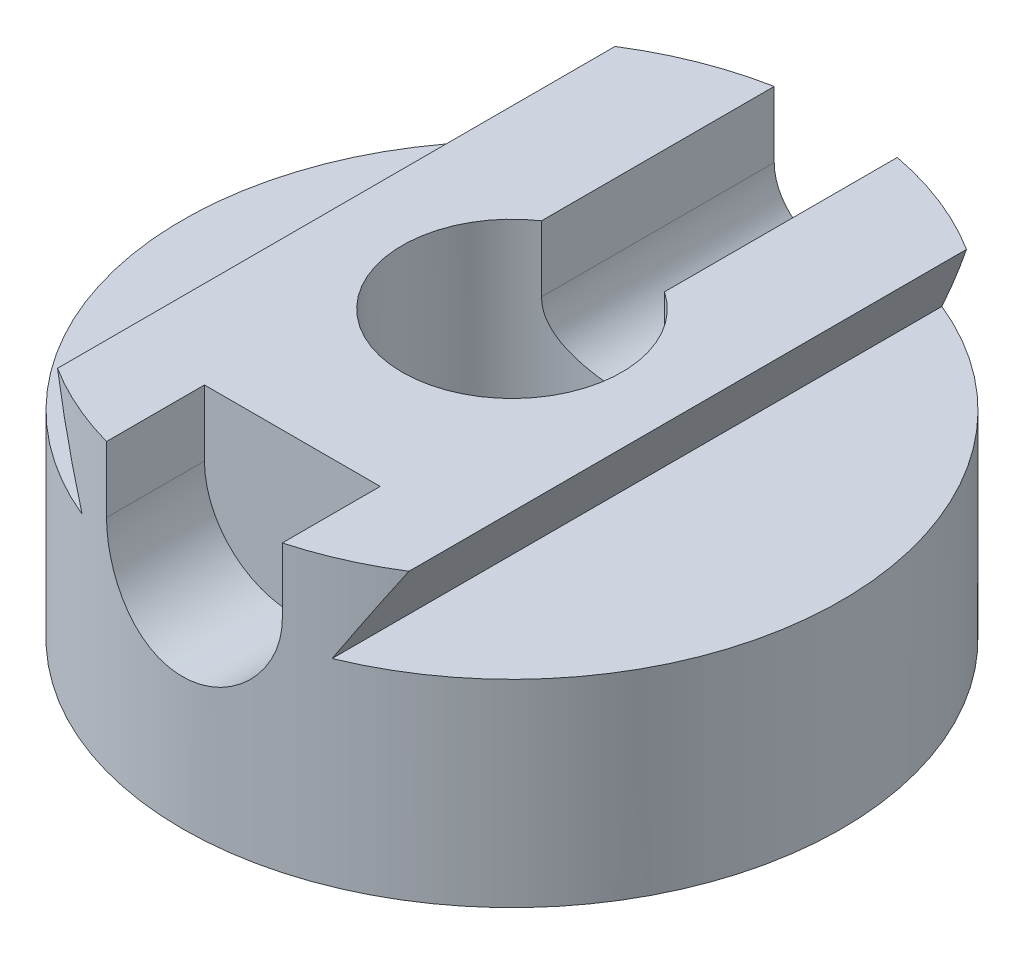
ISO-10303-21;
HEADER;
FILE_DESCRIPTION(('STEP AP214'),'2;1');
FILE_NAME('part.step','',(''),(''),'','','');
FILE_SCHEMA(('AUTOMOTIVE_DESIGN { 1 0 10303 214 1 1 1 1 }'));
ENDSEC;
DATA;
#1=APPLICATION_CONTEXT('core data for automotive mechanical design processes');
#2=APPLICATION_PROTOCOL_DEFINITION('international standard','automotive_design',2000,#1);
#3=PRODUCT_CONTEXT('',#1,'mechanical');
#4=PRODUCT('Part','Part','',(#3));
#5=PRODUCT_RELATED_PRODUCT_CATEGORY('part','',(#4));
#6=PRODUCT_DEFINITION_FORMATION('','',#4);
#7=PRODUCT_DEFINITION_CONTEXT('part definition',#1,'design');
#8=PRODUCT_DEFINITION('design','',#6,#7);
#9=PRODUCT_DEFINITION_SHAPE('','',#8);
#10=(LENGTH_UNIT() NAMED_UNIT(*) SI_UNIT(.MILLI.,.METRE.));
#11=(NAMED_UNIT(*) PLANE_ANGLE_UNIT() SI_UNIT($,.RADIAN.));
#12=(NAMED_UNIT(*) SI_UNIT($,.STERADIAN.) SOLID_ANGLE_UNIT());
#13=UNCERTAINTY_MEASURE_WITH_UNIT(LENGTH_MEASURE(1.E-05),#10,'distance_accuracy_value','');
#14=(GEOMETRIC_REPRESENTATION_CONTEXT(3) GLOBAL_UNCERTAINTY_ASSIGNED_CONTEXT((#13)) GLOBAL_UNIT_ASSIGNED_CONTEXT((#10,
#11,#12)) REPRESENTATION_CONTEXT('',''));
#15=CARTESIAN_POINT('',(0.,0.,0.));
#16=DIRECTION('',(0.,0.,1.));
#17=DIRECTION('',(1.,0.,0.));
#18=AXIS2_PLACEMENT_3D('',#15,#16,#17);
#19=CARTESIAN_POINT('',(0.,65.,0.));
#20=DIRECTION('',(0.,-1.,0.));
#21=DIRECTION('',(0.,0.,-1.));
#22=AXIS2_PLACEMENT_3D('',#19,#20,#21);
#23=CYLINDRICAL_SURFACE('',#22,75.);
#24=CARTESIAN_POINT('',(0.,0.,0.));
#25=DIRECTION('',(0.,1.,0.));
#26=DIRECTION('',(0.,0.,1.));
#27=AXIS2_PLACEMENT_3D('',#24,#25,#26);
#28=CIRCLE('',#27,75.);
#29=CARTESIAN_POINT('',(0.,0.,75.));
#30=VERTEX_POINT('',#29);
#31=EDGE_CURVE('E247',#30,#30,#28,.T.);
#32=ORIENTED_EDGE('',*,*,#31,.T.);
#33=EDGE_LOOP('',(#32));
#34=FACE_BOUND('',#33,.T.);
#35=CARTESIAN_POINT('',(0.,65.,0.));
#36=DIRECTION('',(0.,1.,0.));
#37=DIRECTION('',(0.,0.,1.));
#38=AXIS2_PLACEMENT_3D('',#35,#36,#37);
#39=CIRCLE('',#38,75.);
#40=CARTESIAN_POINT('',(20.,65.,72.2841614740048));
#41=VERTEX_POINT('',#40);
#42=CARTESIAN_POINT('',(40.,65.,63.4428877022476));
#43=VERTEX_POINT('',#42);
#44=EDGE_CURVE('E250',#41,#43,#39,.T.);
#45=ORIENTED_EDGE('',*,*,#44,.F.);
#46=DIRECTION('',(0.,-1.,0.));
#47=VECTOR('',#46,1.);
#48=CARTESIAN_POINT('',(20.,65.,72.2841614740048));
#49=LINE('',#48,#47);
#50=CARTESIAN_POINT('',(20.,50.,72.2841614740048));
#51=VERTEX_POINT('',#50);
#52=EDGE_CURVE('E179',#41,#51,#49,.T.);
#53=ORIENTED_EDGE('',*,*,#52,.T.);
#54=CARTESIAN_POINT('',(-20.,50.,72.2841614740048));
#55=CARTESIAN_POINT('',(-20.0000009389047,49.724090827035,72.2841588743927));
#56=CARTESIAN_POINT('',(-19.9942897855747,49.4482136137117,72.2857416908188));
#57=CARTESIAN_POINT('',(-19.9714655852583,48.8969759323608,72.2920518932551));
#58=CARTESIAN_POINT('',(-19.9543528980324,48.6216154483032,72.2967791800455));
#59=CARTESIAN_POINT('',(-19.8859636757369,47.7971821290675,72.3156334750317));
#60=CARTESIAN_POINT('',(-19.8176359417716,47.249535926604,72.3344329587101));
#61=CARTESIAN_POINT('',(-19.6362791067242,46.163462579828,72.3838747550312));
#62=CARTESIAN_POINT('',(-19.5233463982836,45.6250181507861,72.4144915269438));
#63=CARTESIAN_POINT('',(-19.3212029280493,44.8263554020395,72.4685855711));
#64=CARTESIAN_POINT('',(-19.248359095569,44.5616197505789,72.4879797882607));
#65=CARTESIAN_POINT('',(-19.0918822097284,44.0354904115237,72.529349854291));
#66=CARTESIAN_POINT('',(-19.0082465492059,43.7740975483292,72.5513263268841));
#67=CARTESIAN_POINT('',(-18.7414874232993,42.9959151174134,72.6208684616522));
#68=CARTESIAN_POINT('',(-18.5424347585172,42.4848176566141,72.6720677172806));
#69=CARTESIAN_POINT('',(-18.1034203625736,41.4814272484155,72.7826719872263));
#70=CARTESIAN_POINT('',(-17.8634575357592,40.989134805083,72.8420772213073));
#71=CARTESIAN_POINT('',(-17.4741734974188,40.2671628421776,72.9360751292639));
#72=CARTESIAN_POINT('',(-17.3394757736583,40.0291785955979,72.96823352628));
#73=CARTESIAN_POINT('',(-17.0605679224019,39.5591337301117,73.033947942724));
#74=CARTESIAN_POINT('',(-16.9163602426816,39.3270716080686,73.0675036016962));
#75=CARTESIAN_POINT('',(-16.4697508078497,38.6401786557828,73.1699434516336));
#76=CARTESIAN_POINT('',(-16.1533449871987,38.1946084889382,73.2406048282909));
#77=CARTESIAN_POINT('',(-15.4779357644786,37.3214736861623,73.386344043543));
#78=CARTESIAN_POINT('',(-15.11813559149,36.8945377418555,73.4614854148918));
#79=CARTESIAN_POINT('',(-14.3641879618996,36.0722863830789,73.6126203885893));
#80=CARTESIAN_POINT('',(-13.9700399821952,35.6769714503599,73.6886140039021));
#81=CARTESIAN_POINT('',(-13.1498969359621,34.9204942782193,73.8393800235229));
#82=CARTESIAN_POINT('',(-12.7238968343808,34.5593374588958,73.91415223247));
#83=CARTESIAN_POINT('',(-11.8428337933955,33.8736584662439,74.0604258080261));
#84=CARTESIAN_POINT('',(-11.387770714756,33.5491364684469,74.131927158962));
#85=CARTESIAN_POINT('',(-10.4439906314951,32.9340874851095,74.2708162541828));
#86=CARTESIAN_POINT('',(-9.95485054647007,32.6441900910267,74.3381195022072));
#87=CARTESIAN_POINT('',(-8.95290747552336,32.1067434449995,74.4654311495898));
#88=CARTESIAN_POINT('',(-8.44010415740018,31.8591947878068,74.5254394464933));
#89=CARTESIAN_POINT('',(-7.39451246937258,31.4084636545923,74.6364354304077));
#90=CARTESIAN_POINT('',(-6.86172766673716,31.2052733031046,74.6874247183666));
#91=CARTESIAN_POINT('',(-5.77993995864935,30.8449145807528,74.7789201210429));
#92=CARTESIAN_POINT('',(-5.23093748617975,30.6877449824372,74.8194265153533));
#93=CARTESIAN_POINT('',(-4.13351799290343,30.423861582026,74.8879785633119));
#94=CARTESIAN_POINT('',(-3.58537531226027,30.3160750372337,74.9162882588522));
#95=CARTESIAN_POINT('',(-2.48151614692736,30.1466915236027,74.9609709502207));
#96=CARTESIAN_POINT('',(-1.92579976670742,30.0850939183,74.9773441105293));
#97=CARTESIAN_POINT('',(-0.811003191224979,30.0086420424,74.9976868432757));
#98=CARTESIAN_POINT('',(-0.251923420394365,29.9937819929361,75.0016579491656));
#99=CARTESIAN_POINT('',(0.865461617366286,30.0109236478374,74.9970872818573));
#100=CARTESIAN_POINT('',(1.42376689521104,30.0429246849471,74.9885456868277));
#101=CARTESIAN_POINT('',(2.52135833020087,30.1520984276819,74.9595659441106));
#102=CARTESIAN_POINT('',(3.06076861735047,30.2281093906004,74.9394338292197));
#103=CARTESIAN_POINT('',(4.13107211651945,30.423734021589,74.888058397203));
#104=CARTESIAN_POINT('',(4.66196549645717,30.5433468289046,74.8568152994221));
#105=CARTESIAN_POINT('',(5.71159732055907,30.8251997362582,74.7840520951521));
#106=CARTESIAN_POINT('',(6.23033545950798,30.9874409054378,74.7425317309053));
#107=CARTESIAN_POINT('',(7.25217676710926,31.3532725365359,74.6503123549507));
#108=CARTESIAN_POINT('',(7.75527968959732,31.5568636490972,74.5996131988155));
#109=CARTESIAN_POINT('',(8.74748521491423,32.0060840617605,74.4898189394099));
#110=CARTESIAN_POINT('',(9.23639916808657,32.2521107545978,74.4306454580048));
#111=CARTESIAN_POINT('',(10.1918055532331,32.782980246427,74.3058492610379));
#112=CARTESIAN_POINT('',(10.658297900567,33.0678231919327,74.2402265211334));
#113=CARTESIAN_POINT('',(11.5660115478821,33.6743947180412,74.1042377164168));
#114=CARTESIAN_POINT('',(12.0072292276365,33.9961285630143,74.0338709752226));
#115=CARTESIAN_POINT('',(12.8616123990963,34.6743212304264,73.8902336059676));
#116=CARTESIAN_POINT('',(13.2747773426602,35.0307807310623,73.816962921209));
#117=CARTESIAN_POINT('',(14.0827164003999,35.7875844119563,73.6671639904153));
#118=CARTESIAN_POINT('',(14.4765398766838,36.1889381977153,73.5906046990676));
#119=CARTESIAN_POINT('',(15.2291001578382,37.0234723224029,73.4385589051107));
#120=CARTESIAN_POINT('',(15.5878359965353,37.4566535371569,73.3630724320914));
#121=CARTESIAN_POINT('',(16.2679346581778,38.3522349555349,73.2152679745083));
#122=CARTESIAN_POINT('',(16.5892864557307,38.8146437172764,73.1429509285792));
#123=CARTESIAN_POINT('',(17.0413671753268,39.5276049434427,73.0384537248681));
#124=CARTESIAN_POINT('',(17.1870731659789,39.7684902280272,73.0042835031794));
#125=CARTESIAN_POINT('',(17.4683169931754,40.2564269706133,72.9374991805853));
#126=CARTESIAN_POINT('',(17.6038520136007,40.5034801113103,72.9048855115585));
#127=CARTESIAN_POINT('',(17.9964554966508,41.2564678827596,72.8093439101724));
#128=CARTESIAN_POINT('',(18.2375852211686,41.7711781106441,72.7491678211407));
#129=CARTESIAN_POINT('',(18.6754409668385,42.8201068992815,72.6379997616019));
#130=CARTESIAN_POINT('',(18.8721683475396,43.3543248621479,72.5870075099058));
#131=CARTESIAN_POINT('',(19.1326078908834,44.1669742177175,72.5186271580168));
#132=CARTESIAN_POINT('',(19.2136182349609,44.4396239264584,72.4971925721892));
#133=CARTESIAN_POINT('',(19.3639681142896,44.9882508630952,72.4571789778641));
#134=CARTESIAN_POINT('',(19.4333105688443,45.2642272400857,72.4385992551818));
#135=CARTESIAN_POINT('',(19.6235713180191,46.096292739933,72.3873807158414));
#136=CARTESIAN_POINT('',(19.7268240156717,46.6568333953075,72.3592357394296));
#137=CARTESIAN_POINT('',(19.870573514459,47.6812728490975,72.3198791341929));
#138=CARTESIAN_POINT('',(19.9191182851174,48.1439910865594,72.3065055466939));
#139=CARTESIAN_POINT('',(19.9838187242151,49.0711179248659,72.2886382889566));
#140=CARTESIAN_POINT('',(20.0000256198739,49.5355226828131,72.2841305742343));
#141=CARTESIAN_POINT('',(20.,50.,72.2841614740048));
#142=B_SPLINE_CURVE_WITH_KNOTS('',3,(#54,#55,#56,#57,#58,#59,#60,#61,#62,#63,#64,#65,#66,#67,
#68,#69,#70,#71,#72,#73,#74,#75,#76,#77,#78,#79,#80,#81,#82,#83,#84,#85,#86,#87,#88,#89,#90,#91,
#92,#93,#94,#95,#96,#97,#98,#99,#100,#101,#102,#103,#104,#105,#106,#107,#108,#109,#110,#111,
#112,#113,#114,#115,#116,#117,#118,#119,#120,#121,#122,#123,#124,#125,#126,#127,#128,#129,#130,
#131,#132,#133,#134,#135,#136,#137,#138,#139,#140,#141),.UNSPECIFIED.,.F.,.F.,(4,2,2,2,2,2,2,2,
2,2,2,2,2,2,2,2,2,2,2,2,2,2,2,2,2,2,2,2,2,2,2,2,2,2,2,2,2,2,2,2,2,2,2,4),(0.,0.827600271086224,
1.65517442955861,3.30966047903457,4.96059052863485,5.78615316988952,6.6119156308262,
8.26250052069606,9.91312962335255,10.7389574717174,11.5645735829843,13.2156937599265,
14.9038771965632,16.5920863480183,18.2805629311521,19.9690476040902,21.6846466677335,
23.4002698235206,25.1155881358407,26.8308606935444,28.5068643634646,30.1828449383392,
31.8586182783917,33.5343677573232,35.1677775062473,36.8011550113844,38.4345734863967,
40.0680176652964,41.7176831750604,43.3673549117346,45.0172623519689,46.66720202159,
48.3676678921652,50.068180573599,51.7691935097199,52.6197465661596,53.4705342598249,
55.1830046526352,56.8954226044479,57.7508912247105,58.6061454876003,60.3156612858667,
61.7108602564984,63.1038472979879),.UNSPECIFIED.);
#143=CARTESIAN_POINT('',(-20.,50.,72.2841614740048));
#144=VERTEX_POINT('',#143);
#145=EDGE_CURVE('E12',#144,#51,#142,.T.);
#146=ORIENTED_EDGE('',*,*,#145,.F.);
#147=DIRECTION('',(0.,-1.,0.));
#148=VECTOR('',#147,1.);
#149=CARTESIAN_POINT('',(-20.,65.,72.2841614740048));
#150=LINE('',#149,#148);
#151=CARTESIAN_POINT('',(-20.,65.,72.2841614740048));
#152=VERTEX_POINT('',#151);
#153=EDGE_CURVE('E158',#144,#152,#150,.F.);
#154=ORIENTED_EDGE('',*,*,#153,.T.);
#155=CARTESIAN_POINT('',(-40.,65.,63.4428877022476));
#156=VERTEX_POINT('',#155);
#157=EDGE_CURVE('E256',#156,#152,#39,.T.);
#158=ORIENTED_EDGE('',*,*,#157,.F.);
#159=CARTESIAN_POINT('',(0.,-4.28203230275438,0.));
#160=DIRECTION('',(0.866025403784436,0.500000000000004,0.));
#161=DIRECTION('',(0.500000000000004,-0.866025403784436,0.));
#162=AXIS2_PLACEMENT_3D('',#159,#160,#161);
#163=ELLIPSE('',#162,149.999999999999,75.);
#164=CARTESIAN_POINT('',(-28.4529946162074,45.,69.3932784739997));
#165=VERTEX_POINT('',#164);
#166=EDGE_CURVE('E299',#156,#165,#163,.T.);
#167=ORIENTED_EDGE('',*,*,#166,.T.);
#168=CARTESIAN_POINT('',(0.,45.,0.));
#169=DIRECTION('',(0.,-1.,0.));
#170=DIRECTION('',(0.,0.,-1.));
#171=AXIS2_PLACEMENT_3D('',#168,#169,#170);
#172=CIRCLE('',#171,75.);
#173=CARTESIAN_POINT('',(-28.4529946162074,45.,-69.3932784739997));
#174=VERTEX_POINT('',#173);
#175=EDGE_CURVE('E295',#165,#174,#172,.T.);
#176=ORIENTED_EDGE('',*,*,#175,.T.);
#177=CARTESIAN_POINT('',(-40.,65.,-63.4428877022476));
#178=VERTEX_POINT('',#177);
#179=EDGE_CURVE('E303',#174,#178,#163,.T.);
#180=ORIENTED_EDGE('',*,*,#179,.T.);
#181=CARTESIAN_POINT('',(-14.,65.,-73.6817480791546));
#182=VERTEX_POINT('',#181);
#183=EDGE_CURVE('E259',#182,#178,#39,.T.);
#184=ORIENTED_EDGE('',*,*,#183,.F.);
#185=DIRECTION('',(0.,-1.,0.));
#186=VECTOR('',#185,1.);
#187=CARTESIAN_POINT('',(-14.,65.,-73.6817480791546));
#188=LINE('',#187,#186);
#189=CARTESIAN_POINT('',(-14.,50.,-73.6817480791546));
#190=VERTEX_POINT('',#189);
#191=EDGE_CURVE('E270',#190,#182,#188,.F.);
#192=ORIENTED_EDGE('',*,*,#191,.F.);
#193=CARTESIAN_POINT('',(-14.,50.,-73.6817480791546));
#194=CARTESIAN_POINT('',(-14.0000461131646,49.6099044755248,-73.681715681251));
#195=CARTESIAN_POINT('',(-13.983697595175,49.2198202407486,-73.684844921959));
#196=CARTESIAN_POINT('',(-13.9185479324005,48.4425111343057,-73.6971916183417));
#197=CARTESIAN_POINT('',(-13.8697504773536,48.0552859426012,-73.7064083818092));
#198=CARTESIAN_POINT('',(-13.7401312113113,47.2869857299913,-73.7306779766975));
#199=CARTESIAN_POINT('',(-13.6593548155063,46.9059027814312,-73.7457225310771));
#200=CARTESIAN_POINT('',(-13.4664195247798,46.1520250178608,-73.7811982885116));
#201=CARTESIAN_POINT('',(-13.3542605695032,45.7792302187918,-73.8016295019263));
#202=CARTESIAN_POINT('',(-13.0993930476061,45.0444845681644,-73.8472926421149));
#203=CARTESIAN_POINT('',(-12.9566803790752,44.6825351800738,-73.8725252134323));
#204=CARTESIAN_POINT('',(-12.6417722020478,43.9720152716684,-73.9270662118679));
#205=CARTESIAN_POINT('',(-12.4695763028752,43.6234449287114,-73.9563746929942));
#206=CARTESIAN_POINT('',(-12.0969369202066,42.942031333523,-74.0182394408445));
#207=CARTESIAN_POINT('',(-11.8964922254954,42.6091887564639,-74.0507958468114));
#208=CARTESIAN_POINT('',(-11.4687685376597,41.9614694082599,-74.1182447435637));
#209=CARTESIAN_POINT('',(-11.2414894090489,41.6465927278364,-74.1531372461438));
#210=CARTESIAN_POINT('',(-10.7590273416317,41.0335550593643,-74.2246820844013));
#211=CARTESIAN_POINT('',(-10.5035663028945,40.7356146613924,-74.2613494980626));
#212=CARTESIAN_POINT('',(-9.96856709488272,40.1622452976682,-74.3350560915226));
#213=CARTESIAN_POINT('',(-9.68902872107923,39.8868165231833,-74.3720952744771));
#214=CARTESIAN_POINT('',(-9.10773121090196,39.3603085900815,-74.4455173123978));
#215=CARTESIAN_POINT('',(-8.80596869497112,39.1092331483074,-74.4819000664914));
#216=CARTESIAN_POINT('',(-8.18230388748293,38.6332154440413,-74.5529904614149));
#217=CARTESIAN_POINT('',(-7.86040156036744,38.4082732276912,-74.587698099287));
#218=CARTESIAN_POINT('',(-7.19614064995402,37.984512930033,-74.6547239616725));
#219=CARTESIAN_POINT('',(-6.85364591230589,37.7859050196286,-74.6870221566968));
#220=CARTESIAN_POINT('',(-6.15281109352887,37.4182873477219,-74.7480208424466));
#221=CARTESIAN_POINT('',(-5.79447090638851,37.2492777842801,-74.7767213090972));
#222=CARTESIAN_POINT('',(-5.06451859873723,36.9421510245207,-74.829703509961));
#223=CARTESIAN_POINT('',(-4.69290805703081,36.8040301674088,-74.8539857677373));
#224=CARTESIAN_POINT('',(-3.93904192498045,36.5597268635049,-74.8974397330204));
#225=CARTESIAN_POINT('',(-3.55678647039574,36.4535440095971,-74.9166115056706));
#226=CARTESIAN_POINT('',(-2.78885837364468,36.274990824951,-74.9491044248334));
#227=CARTESIAN_POINT('',(-2.40327562576849,36.2022455815099,-74.9624903372846));
#228=CARTESIAN_POINT('',(-1.62720782148899,36.0893585215523,-74.9833505626271));
#229=CARTESIAN_POINT('',(-1.23672279873203,36.0492164813905,-74.9908249160693));
#230=CARTESIAN_POINT('',(-0.453711953263457,36.0018581305086,-74.9996495493285));
#231=CARTESIAN_POINT('',(-0.061186235010665,35.9946401507705,-75.0010001395771));
#232=CARTESIAN_POINT('',(0.723056613578404,36.013183663695,-74.9975396119885));
#233=CARTESIAN_POINT('',(1.11477374935885,36.0389449335787,-74.9927285357742));
#234=CARTESIAN_POINT('',(1.88968689756311,36.1227138820662,-74.9771792436784));
#235=CARTESIAN_POINT('',(2.27292829102583,36.1803163723742,-74.9665155163015));
#236=CARTESIAN_POINT('',(3.03312640635871,36.3270339999819,-74.9396077193702));
#237=CARTESIAN_POINT('',(3.41008318895364,36.4161488326101,-74.923363703768));
#238=CARTESIAN_POINT('',(4.15508785478902,36.6252127173509,-74.8857421180743));
#239=CARTESIAN_POINT('',(4.52313558639427,36.7451622938786,-74.8643644606739));
#240=CARTESIAN_POINT('',(5.24778505691434,37.0149994866844,-74.8170609393497));
#241=CARTESIAN_POINT('',(5.60438669838531,37.1648873577572,-74.7911350367175));
#242=CARTESIAN_POINT('',(6.30568733276343,37.4944310951566,-74.735284503779));
#243=CARTESIAN_POINT('',(6.65030838518436,37.6742491430818,-74.7053382696978));
#244=CARTESIAN_POINT('',(7.32320364175668,38.061765989775,-74.6423800310305));
#245=CARTESIAN_POINT('',(7.65147780381272,38.2694648603346,-74.6093680185503));
#246=CARTESIAN_POINT('',(8.28950599277982,38.7113032759064,-74.5411768544048));
#247=CARTESIAN_POINT('',(8.59925907196022,38.9454441721989,-74.5059975920273));
#248=CARTESIAN_POINT('',(9.19817535688007,39.4385587943262,-74.4344311966408));
#249=CARTESIAN_POINT('',(9.48733837920432,39.6975327413243,-74.3980440528764));
#250=CARTESIAN_POINT('',(10.0473548704893,40.2426618312193,-74.3245022475479));
#251=CARTESIAN_POINT('',(10.3178660847564,40.5291682529597,-74.2873442912407));
#252=CARTESIAN_POINT('',(10.8338368802432,41.1240210792284,-74.2138525446182));
#253=CARTESIAN_POINT('',(11.0792960197473,41.4323678686814,-74.1775187688435));
#254=CARTESIAN_POINT('',(11.5435129666892,42.0688893435933,-74.1066965529058));
#255=CARTESIAN_POINT('',(11.7622628455093,42.3970698736671,-74.0722086623902));
#256=CARTESIAN_POINT('',(12.1714072146035,43.0709159007018,-74.0060795417091));
#257=CARTESIAN_POINT('',(12.3618026157652,43.4165808354982,-73.9744382201105));
#258=CARTESIAN_POINT('',(12.713250812505,44.1238165878411,-73.9148504245618));
#259=CARTESIAN_POINT('',(12.8742358359403,44.4854218175637,-73.8869125242583));
#260=CARTESIAN_POINT('',(13.165105822941,45.2212460702201,-73.8356405474186));
#261=CARTESIAN_POINT('',(13.2949913427021,45.5954648674315,-73.8123063885488));
#262=CARTESIAN_POINT('',(13.5225129804343,46.35335744909,-73.7709631980104));
#263=CARTESIAN_POINT('',(13.6201887753282,46.7370189705751,-73.7529476176432));
#264=CARTESIAN_POINT('',(13.7826979132315,47.5113029091024,-73.7227514013996));
#265=CARTESIAN_POINT('',(13.8475469330015,47.9019219110897,-73.7105679804676));
#266=CARTESIAN_POINT('',(13.9304770427251,48.5776276905198,-73.6949324663381));
#267=CARTESIAN_POINT('',(13.9565610481954,48.8617243550859,-73.6899922319146));
#268=CARTESIAN_POINT('',(13.9913124645986,49.4305385027522,-73.6833987412027));
#269=CARTESIAN_POINT('',(14.0000091142964,49.715254136267,-73.6817399668251));
#270=CARTESIAN_POINT('',(14.,50.,-73.6817480791546));
#271=B_SPLINE_CURVE_WITH_KNOTS('',3,(#193,#194,#195,#196,#197,#198,#199,#200,#201,#202,#203,
#204,#205,#206,#207,#208,#209,#210,#211,#212,#213,#214,#215,#216,#217,#218,#219,#220,#221,#222,
#223,#224,#225,#226,#227,#228,#229,#230,#231,#232,#233,#234,#235,#236,#237,#238,#239,#240,#241,
#242,#243,#244,#245,#246,#247,#248,#249,#250,#251,#252,#253,#254,#255,#256,#257,#258,#259,#260,
#261,#262,#263,#264,#265,#266,#267,#268,#269,#270),.UNSPECIFIED.,.F.,.F.,(4,2,2,2,2,2,2,2,2,2,2,
2,2,2,2,2,2,2,2,2,2,2,2,2,2,2,2,2,2,2,2,2,2,2,2,2,2,2,4),(0.,1.16991470104871,2.33969639494433,
3.50782273778658,4.67595132719244,5.84423683916001,7.01253783303836,8.18088893506206,
9.34924593631622,10.5303864869409,11.7115370719492,12.8928676432477,14.0742003003203,
15.2644564773381,16.4547206187811,17.64484362049,18.8349514509832,20.0113688163379,
21.1877781118619,22.3641277710566,23.5404694839068,24.7021754912785,25.8638702672063,
27.0255848017078,28.1873092235975,29.3555468011417,30.5237873868932,31.6920877008787,
32.8603984207229,34.0463440814673,35.2323106490737,36.4186284181596,37.6049080685665,
38.7938877735646,39.9828462127988,41.1703345375558,42.3572552288993,43.2127357249488,
44.0667764217065),.UNSPECIFIED.);
#272=CARTESIAN_POINT('',(14.,50.,-73.6817480791546));
#273=VERTEX_POINT('',#272);
#274=EDGE_CURVE('E352',#190,#273,#271,.T.);
#275=ORIENTED_EDGE('',*,*,#274,.T.);
#276=DIRECTION('',(0.,-1.,0.));
#277=VECTOR('',#276,1.);
#278=CARTESIAN_POINT('',(14.,65.,-73.6817480791546));
#279=LINE('',#278,#277);
#280=CARTESIAN_POINT('',(14.,65.,-73.6817480791546));
#281=VERTEX_POINT('',#280);
#282=EDGE_CURVE('E267',#281,#273,#279,.T.);
#283=ORIENTED_EDGE('',*,*,#282,.F.);
#284=CARTESIAN_POINT('',(40.,65.,-63.4428877022476));
#285=VERTEX_POINT('',#284);
#286=EDGE_CURVE('E257',#285,#281,#39,.T.);
#287=ORIENTED_EDGE('',*,*,#286,.F.);
#288=CARTESIAN_POINT('',(0.,-4.28203230275442,0.));
#289=DIRECTION('',(-0.866025403784437,0.500000000000004,0.));
#290=DIRECTION('',(-0.500000000000004,-0.866025403784437,0.));
#291=AXIS2_PLACEMENT_3D('',#288,#289,#290);
#292=ELLIPSE('',#291,149.999999999999,75.);
#293=CARTESIAN_POINT('',(28.4529946162074,45.,-69.3932784739997));
#294=VERTEX_POINT('',#293);
#295=EDGE_CURVE('E283',#285,#294,#292,.T.);
#296=ORIENTED_EDGE('',*,*,#295,.T.);
#297=CARTESIAN_POINT('',(0.,45.,0.));
#298=DIRECTION('',(0.,-1.,0.));
#299=DIRECTION('',(0.,0.,-1.));
#300=AXIS2_PLACEMENT_3D('',#297,#298,#299);
#301=CIRCLE('',#300,75.);
#302=CARTESIAN_POINT('',(28.4529946162074,45.,69.3932784739998));
#303=VERTEX_POINT('',#302);
#304=EDGE_CURVE('E292',#294,#303,#301,.T.);
#305=ORIENTED_EDGE('',*,*,#304,.T.);
#306=EDGE_CURVE('E252',#303,#43,#292,.T.);
#307=ORIENTED_EDGE('',*,*,#306,.T.);
#308=EDGE_LOOP('',(#45,#53,#146,#154,#158,#167,#176,#180,#184,#192,#275,#283,#287,#296,#305,#307));
#309=FACE_BOUND('',#308,.T.);
#310=ADVANCED_FACE('F54',(#34,#309),#23,.T.);
#311=CARTESIAN_POINT('',(0.,65.,0.));
#312=DIRECTION('',(0.,-1.,0.));
#313=DIRECTION('',(0.,0.,-1.));
#314=AXIS2_PLACEMENT_3D('',#311,#312,#313);
#315=CYLINDRICAL_SURFACE('',#314,12.5);
#316=CARTESIAN_POINT('',(0.,0.,0.));
#317=DIRECTION('',(0.,1.,0.));
#318=DIRECTION('',(0.,0.,1.));
#319=AXIS2_PLACEMENT_3D('',#316,#317,#318);
#320=CIRCLE('',#319,12.5);
#321=CARTESIAN_POINT('',(0.,0.,12.5));
#322=VERTEX_POINT('',#321);
#323=EDGE_CURVE('E356',#322,#322,#320,.T.);
#324=ORIENTED_EDGE('',*,*,#323,.F.);
#325=EDGE_LOOP('',(#324));
#326=FACE_BOUND('',#325,.T.);
#327=CARTESIAN_POINT('',(0.,25.,0.));
#328=DIRECTION('',(0.,1.,0.));
#329=DIRECTION('',(0.,0.,1.));
#330=AXIS2_PLACEMENT_3D('',#327,#328,#329);
#331=CIRCLE('',#330,12.5);
#332=CARTESIAN_POINT('',(0.,25.,12.5));
#333=VERTEX_POINT('',#332);
#334=EDGE_CURVE('E284',#333,#333,#331,.T.);
#335=ORIENTED_EDGE('',*,*,#334,.T.);
#336=EDGE_LOOP('',(#335));
#337=FACE_BOUND('',#336,.T.);
#338=ADVANCED_FACE('F236',(#326,#337),#315,.F.);
#339=CARTESIAN_POINT('',(0.,65.,0.));
#340=DIRECTION('',(0.,1.,0.));
#341=DIRECTION('',(0.,0.,1.));
#342=AXIS2_PLACEMENT_3D('',#339,#340,#341);
#343=PLANE('',#342);
#344=DIRECTION('',(0.,0.,-1.));
#345=VECTOR('',#344,1.);
#346=CARTESIAN_POINT('',(20.,65.,0.));
#347=LINE('',#346,#345);
#348=CARTESIAN_POINT('',(20.,65.,50.));
#349=VERTEX_POINT('',#348);
#350=EDGE_CURVE('E68',#41,#349,#347,.T.);
#351=ORIENTED_EDGE('',*,*,#350,.F.);
#352=ORIENTED_EDGE('',*,*,#44,.T.);
#353=DIRECTION('',(0.,0.,1.));
#354=VECTOR('',#353,1.);
#355=CARTESIAN_POINT('',(40.,65.,-97.5000000000001));
#356=LINE('',#355,#354);
#357=EDGE_CURVE('E182',#285,#43,#356,.T.);
#358=ORIENTED_EDGE('',*,*,#357,.F.);
#359=ORIENTED_EDGE('',*,*,#286,.T.);
#360=DIRECTION('',(0.,0.,1.));
#361=VECTOR('',#360,1.);
#362=CARTESIAN_POINT('',(14.,65.,0.));
#363=LINE('',#362,#361);
#364=CARTESIAN_POINT('',(14.,65.,-20.712315177208));
#365=VERTEX_POINT('',#364);
#366=EDGE_CURVE('E349',#281,#365,#363,.T.);
#367=ORIENTED_EDGE('',*,*,#366,.T.);
#368=CARTESIAN_POINT('',(0.,65.,0.));
#369=DIRECTION('',(0.,1.,0.));
#370=DIRECTION('',(0.,0.,1.));
#371=AXIS2_PLACEMENT_3D('',#368,#369,#370);
#372=CIRCLE('',#371,25.);
#373=CARTESIAN_POINT('',(-14.,65.,-20.712315177208));
#374=VERTEX_POINT('',#373);
#375=EDGE_CURVE('E187',#374,#365,#372,.T.);
#376=ORIENTED_EDGE('',*,*,#375,.F.);
#377=DIRECTION('',(0.,0.,-1.));
#378=VECTOR('',#377,1.);
#379=CARTESIAN_POINT('',(-14.,65.,0.));
#380=LINE('',#379,#378);
#381=EDGE_CURVE('E351',#374,#182,#380,.T.);
#382=ORIENTED_EDGE('',*,*,#381,.T.);
#383=ORIENTED_EDGE('',*,*,#183,.T.);
#384=DIRECTION('',(0.,0.,1.));
#385=VECTOR('',#384,1.);
#386=CARTESIAN_POINT('',(-40.,65.,-97.5000000000001));
#387=LINE('',#386,#385);
#388=EDGE_CURVE('E183',#178,#156,#387,.T.);
#389=ORIENTED_EDGE('',*,*,#388,.T.);
#390=ORIENTED_EDGE('',*,*,#157,.T.);
#391=DIRECTION('',(0.,0.,1.));
#392=VECTOR('',#391,1.);
#393=CARTESIAN_POINT('',(-20.,65.,0.));
#394=LINE('',#393,#392);
#395=CARTESIAN_POINT('',(-20.,65.,50.));
#396=VERTEX_POINT('',#395);
#397=EDGE_CURVE('E307',#396,#152,#394,.T.);
#398=ORIENTED_EDGE('',*,*,#397,.F.);
#399=DIRECTION('',(1.,0.,0.));
#400=VECTOR('',#399,1.);
#401=CARTESIAN_POINT('',(0.,65.,50.));
#402=LINE('',#401,#400);
#403=EDGE_CURVE('E304',#396,#349,#402,.T.);
#404=ORIENTED_EDGE('',*,*,#403,.T.);
#405=EDGE_LOOP('',(#351,#352,#358,#359,#367,#376,#382,#383,#389,#390,#398,#404));
#406=FACE_BOUND('',#405,.T.);
#407=ADVANCED_FACE('F241',(#406),#343,.T.);
#408=CARTESIAN_POINT('',(0.,0.,0.));
#409=DIRECTION('',(0.,1.,0.));
#410=DIRECTION('',(0.,0.,1.));
#411=AXIS2_PLACEMENT_3D('',#408,#409,#410);
#412=PLANE('',#411);
#413=ORIENTED_EDGE('',*,*,#31,.F.);
#414=EDGE_LOOP('',(#413));
#415=FACE_BOUND('',#414,.T.);
#416=ORIENTED_EDGE('',*,*,#323,.T.);
#417=EDGE_LOOP('',(#416));
#418=FACE_BOUND('',#417,.T.);
#419=ADVANCED_FACE('F370',(#415,#418),#412,.F.);
#420=CARTESIAN_POINT('',(0.,50.,-89.));
#421=DIRECTION('',(0.,0.,1.));
#422=DIRECTION('',(1.,0.,0.));
#423=AXIS2_PLACEMENT_3D('',#420,#421,#422);
#424=CYLINDRICAL_SURFACE('',#423,14.);
#425=DIRECTION('',(0.,0.,1.));
#426=VECTOR('',#425,1.);
#427=CARTESIAN_POINT('',(-14.,50.,-89.));
#428=LINE('',#427,#426);
#429=CARTESIAN_POINT('',(-14.,50.,-20.712315177208));
#430=VERTEX_POINT('',#429);
#431=EDGE_CURVE('E288',#190,#430,#428,.T.);
#432=ORIENTED_EDGE('',*,*,#431,.T.);
#433=CARTESIAN_POINT('',(-14.,50.,-20.712315177208));
#434=CARTESIAN_POINT('',(-14.0000017800142,49.8202878782844,-20.7123099219924));
#435=CARTESIAN_POINT('',(-13.9965388394676,49.6406024590154,-20.7146551483799));
#436=CARTESIAN_POINT('',(-13.9827108572867,49.2816283602787,-20.7239933143433));
#437=CARTESIAN_POINT('',(-13.9723462086878,49.1023396588022,-20.7309859892583));
#438=CARTESIAN_POINT('',(-13.9309690938912,48.5659285678663,-20.7588362190213));
#439=CARTESIAN_POINT('',(-13.8896733333023,48.2098824566366,-20.7865662010182));
#440=CARTESIAN_POINT('',(-13.7806853367277,47.5062809202121,-20.8589768015017));
#441=CARTESIAN_POINT('',(-13.7131806954826,47.1586834033389,-20.9035368951576));
#442=CARTESIAN_POINT('',(-13.5527001776093,46.4717216161881,-21.0079381469944));
#443=CARTESIAN_POINT('',(-13.4597201948482,46.1323586827734,-21.0677817684791));
#444=CARTESIAN_POINT('',(-13.2497396571154,45.4649777288362,-21.2004658260517));
#445=CARTESIAN_POINT('',(-13.1328131446127,45.1369282954047,-21.2732661114726));
#446=CARTESIAN_POINT('',(-12.8759382020924,44.4926882312016,-21.4297180160453));
#447=CARTESIAN_POINT('',(-12.7359902794066,44.1764973392874,-21.5133693960587));
#448=CARTESIAN_POINT('',(-12.433947407833,43.5567085729158,-21.6893415936607));
#449=CARTESIAN_POINT('',(-12.2718153970949,43.2531329045839,-21.7816768364828));
#450=CARTESIAN_POINT('',(-11.9265813634817,42.6600791633457,-21.9726097446294));
#451=CARTESIAN_POINT('',(-11.7434715896286,42.3706063579113,-22.0712097186486));
#452=CARTESIAN_POINT('',(-11.3371577504434,41.7773964426476,-22.2828775810649));
#453=CARTESIAN_POINT('',(-11.1117641137041,41.4753132906142,-22.3963828184229));
#454=CARTESIAN_POINT('',(-10.6377852654451,40.8907109294934,-22.6253575056562));
#455=CARTESIAN_POINT('',(-10.3891986431017,40.6081929123718,-22.7408270746715));
#456=CARTESIAN_POINT('',(-9.86979889273846,40.063769968906,-22.9710206111341));
#457=CARTESIAN_POINT('',(-9.59897546809093,39.8018747030237,-23.0857442063256));
#458=CARTESIAN_POINT('',(-9.0363844951948,39.3001981497278,-23.3117057133071));
#459=CARTESIAN_POINT('',(-8.74462378965042,39.0604096953926,-23.422944746999));
#460=CARTESIAN_POINT('',(-8.11389456291431,38.5835726242313,-23.6492465530761));
#461=CARTESIAN_POINT('',(-7.7730434382347,38.3487368013009,-23.7637439762033));
#462=CARTESIAN_POINT('',(-7.06943368714078,37.9088776239195,-23.9824692011904));
#463=CARTESIAN_POINT('',(-6.70667338952835,37.7038565477669,-24.0866962180397));
#464=CARTESIAN_POINT('',(-5.96162981185661,37.3258792549695,-24.2818275766417));
#465=CARTESIAN_POINT('',(-5.57935793496409,37.1529045770162,-24.3727395825512));
#466=CARTESIAN_POINT('',(-4.79780867864136,36.8410497202571,-24.5385516813029));
#467=CARTESIAN_POINT('',(-4.3985336726432,36.7021648011189,-24.6134540001758));
#468=CARTESIAN_POINT('',(-3.62104309190072,36.4708394583001,-24.73923206536));
#469=CARTESIAN_POINT('',(-3.24395068309753,36.3754409394368,-24.7916157025026));
#470=CARTESIAN_POINT('',(-2.48122935991292,36.2161239815692,-24.8795259542071));
#471=CARTESIAN_POINT('',(-2.09560089203879,36.1522039000264,-24.9150534483155));
#472=CARTESIAN_POINT('',(-1.3193762900139,36.0568275859137,-24.9681895403318));
#473=CARTESIAN_POINT('',(-0.928783559365665,36.0253502102283,-24.985809808387));
#474=CARTESIAN_POINT('',(-0.145950740883766,35.9952833532357,-25.0026383190725));
#475=CARTESIAN_POINT('',(0.246289207014261,35.9966911325756,-25.0018480953077));
#476=CARTESIAN_POINT('',(0.986256084695047,36.0304179154303,-24.9829757870031));
#477=CARTESIAN_POINT('',(1.33419132508051,36.0593635555327,-24.966780807183));
#478=CARTESIAN_POINT('',(2.02596436383856,36.1429862964821,-24.9201849629524));
#479=CARTESIAN_POINT('',(2.36980252449024,36.1976611046863,-24.8897853642712));
#480=CARTESIAN_POINT('',(3.0510455967103,36.3320930707447,-24.8154900667577));
#481=CARTESIAN_POINT('',(3.38845037458951,36.4118507492333,-24.7715940877872));
#482=CARTESIAN_POINT('',(4.0546984206159,36.595566269262,-24.6712975753618));
#483=CARTESIAN_POINT('',(4.38354135117538,36.6995250634335,-24.6148965496735));
#484=CARTESIAN_POINT('',(5.03396512120576,36.9317323903623,-24.4902007681538));
#485=CARTESIAN_POINT('',(5.35544257651325,37.0602100055532,-24.4217943725289));
#486=CARTESIAN_POINT('',(5.98608593162911,37.3395999346261,-24.2749173347204));
#487=CARTESIAN_POINT('',(6.2952518981868,37.4905121268534,-24.1964467471116));
#488=CARTESIAN_POINT('',(6.89994292872781,37.8136008980606,-24.031002217543));
#489=CARTESIAN_POINT('',(7.19546570102552,37.9857810317518,-23.9440268546077));
#490=CARTESIAN_POINT('',(7.77168336903166,38.350228418896,-23.7632519267354));
#491=CARTESIAN_POINT('',(8.05237658934438,38.5424979347079,-23.6694515935687));
#492=CARTESIAN_POINT('',(8.62800889421738,38.9682571322268,-23.4661586530056));
#493=CARTESIAN_POINT('',(8.92110878785357,39.2039543393713,-23.356075907083));
#494=CARTESIAN_POINT('',(9.48663053501644,39.6973458659828,-23.1321498390596));
#495=CARTESIAN_POINT('',(9.75905101171701,39.9550416476822,-23.0183062672877));
#496=CARTESIAN_POINT('',(10.2824659209902,40.4915034337932,-22.7893088109965));
#497=CARTESIAN_POINT('',(10.53343283974,40.7702956556069,-22.6741534523116));
#498=CARTESIAN_POINT('',(11.0124770235798,41.3474850145177,-22.4453962812778));
#499=CARTESIAN_POINT('',(11.2405544177571,41.6458820410362,-22.3317944601709));
#500=CARTESIAN_POINT('',(11.693058633945,42.2901631520387,-22.098487053532));
#501=CARTESIAN_POINT('',(11.9151185245847,42.637872804805,-21.979214282954));
#502=CARTESIAN_POINT('',(12.3288476068488,43.3539115266791,-21.7498390595522));
#503=CARTESIAN_POINT('',(12.5205122555918,43.7222436669195,-21.6397379786969));
#504=CARTESIAN_POINT('',(12.8710687390636,44.4765862269863,-21.4330796069032));
#505=CARTESIAN_POINT('',(13.0300476684968,44.8625462270064,-21.3364865481895));
#506=CARTESIAN_POINT('',(13.3138189449224,45.6505843219555,-21.1605803130909));
#507=CARTESIAN_POINT('',(13.4386251612053,46.0526558017222,-21.0812601290443));
#508=CARTESIAN_POINT('',(13.6199245823072,46.7465794488055,-20.9643862549988));
#509=CARTESIAN_POINT('',(13.6856705577391,47.0351434058826,-20.9214489836615));
#510=CARTESIAN_POINT('',(13.7989216931348,47.6172226479915,-20.8469264800234));
#511=CARTESIAN_POINT('',(13.8464321716268,47.9107364632457,-20.8153379379474));
#512=CARTESIAN_POINT('',(13.9228925103842,48.5025369315007,-20.7642797593235));
#513=CARTESIAN_POINT('',(13.9517604713556,48.8008388228699,-20.744863608617));
#514=CARTESIAN_POINT('',(13.9903389284007,49.3994163288603,-20.7188443850233));
#515=CARTESIAN_POINT('',(14.0000375318747,49.6996930528464,-20.7122492662993));
#516=CARTESIAN_POINT('',(14.,50.,-20.712315177208));
#517=B_SPLINE_CURVE_WITH_KNOTS('',3,(#433,#434,#435,#436,#437,#438,#439,#440,#441,#442,#443,
#444,#445,#446,#447,#448,#449,#450,#451,#452,#453,#454,#455,#456,#457,#458,#459,#460,#461,#462,
#463,#464,#465,#466,#467,#468,#469,#470,#471,#472,#473,#474,#475,#476,#477,#478,#479,#480,#481,
#482,#483,#484,#485,#486,#487,#488,#489,#490,#491,#492,#493,#494,#495,#496,#497,#498,#499,#500,
#501,#502,#503,#504,#505,#506,#507,#508,#509,#510,#511,#512,#513,#514,#515,#516),.UNSPECIFIED.,
.F.,.F.,(4,2,2,2,2,2,2,2,2,2,2,2,2,2,2,2,2,2,2,2,2,2,2,2,2,2,2,2,2,2,2,2,2,2,2,2,2,2,2,2,2,4),
(0.,0.539035143676234,1.07803959324795,2.15491669047743,3.22422387482271,4.29370351232145,
5.35992494385221,6.42612288179344,7.49412432161499,8.56252165289051,9.74218349479975,
10.9219171420923,12.1022001729211,13.2820992061404,14.5688024003709,15.8556038666108,
17.141661710624,18.4275406211417,19.603342273776,20.7790825668127,21.9540561370654,
23.1289318316712,24.176223508821,25.2234218828686,26.2706419945979,27.3179033351489,
28.3754761906817,29.4330433115802,30.4907874334236,31.5486508014141,32.7230981647541,
33.8976236538029,35.0736335336992,36.2496367810216,37.5363986153785,38.8233525886348,
40.1068315695605,41.3897888647188,42.2862245403994,43.1823985644254,44.0824833002844,
44.9831262703909),.UNSPECIFIED.);
#518=CARTESIAN_POINT('',(14.,50.,-20.712315177208));
#519=VERTEX_POINT('',#518);
#520=EDGE_CURVE('E201',#430,#519,#517,.T.);
#521=ORIENTED_EDGE('',*,*,#520,.T.);
#522=DIRECTION('',(0.,0.,1.));
#523=VECTOR('',#522,1.);
#524=CARTESIAN_POINT('',(14.,50.,-89.));
#525=LINE('',#524,#523);
#526=EDGE_CURVE('E358',#273,#519,#525,.T.);
#527=ORIENTED_EDGE('',*,*,#526,.F.);
#528=ORIENTED_EDGE('',*,*,#274,.F.);
#529=EDGE_LOOP('',(#432,#521,#527,#528));
#530=FACE_BOUND('',#529,.T.);
#531=ADVANCED_FACE('F215',(#530),#424,.F.);
#532=CARTESIAN_POINT('',(-14.,0.,-89.));
#533=DIRECTION('',(1.,0.,0.));
#534=DIRECTION('',(0.,0.,-1.));
#535=AXIS2_PLACEMENT_3D('',#532,#533,#534);
#536=PLANE('',#535);
#537=DIRECTION('',(0.,1.,0.));
#538=VECTOR('',#537,1.);
#539=CARTESIAN_POINT('',(-14.,25.,-20.712315177208));
#540=LINE('',#539,#538);
#541=EDGE_CURVE('E213',#430,#374,#540,.T.);
#542=ORIENTED_EDGE('',*,*,#541,.F.);
#543=ORIENTED_EDGE('',*,*,#431,.F.);
#544=ORIENTED_EDGE('',*,*,#191,.T.);
#545=ORIENTED_EDGE('',*,*,#381,.F.);
#546=EDGE_LOOP('',(#542,#543,#544,#545));
#547=FACE_BOUND('',#546,.T.);
#548=ADVANCED_FACE('F228',(#547),#536,.T.);
#549=CARTESIAN_POINT('',(14.,0.,-89.));
#550=DIRECTION('',(-1.,0.,0.));
#551=DIRECTION('',(0.,0.,1.));
#552=AXIS2_PLACEMENT_3D('',#549,#550,#551);
#553=PLANE('',#552);
#554=DIRECTION('',(0.,1.,0.));
#555=VECTOR('',#554,1.);
#556=CARTESIAN_POINT('',(14.,25.,-20.712315177208));
#557=LINE('',#556,#555);
#558=EDGE_CURVE('E278',#365,#519,#557,.F.);
#559=ORIENTED_EDGE('',*,*,#558,.F.);
#560=ORIENTED_EDGE('',*,*,#366,.F.);
#561=ORIENTED_EDGE('',*,*,#282,.T.);
#562=ORIENTED_EDGE('',*,*,#526,.T.);
#563=EDGE_LOOP('',(#559,#560,#561,#562));
#564=FACE_BOUND('',#563,.T.);
#565=ADVANCED_FACE('F224',(#564),#553,.T.);
#566=CARTESIAN_POINT('',(0.,25.,0.));
#567=DIRECTION('',(0.,1.,0.));
#568=DIRECTION('',(0.,0.,1.));
#569=AXIS2_PLACEMENT_3D('',#566,#567,#568);
#570=CYLINDRICAL_SURFACE('',#569,25.);
#571=ORIENTED_EDGE('',*,*,#541,.T.);
#572=ORIENTED_EDGE('',*,*,#375,.T.);
#573=ORIENTED_EDGE('',*,*,#558,.T.);
#574=ORIENTED_EDGE('',*,*,#520,.F.);
#575=EDGE_LOOP('',(#571,#572,#573,#574));
#576=FACE_BOUND('',#575,.T.);
#577=CARTESIAN_POINT('',(0.,25.,0.));
#578=DIRECTION('',(0.,1.,0.));
#579=DIRECTION('',(0.,0.,1.));
#580=AXIS2_PLACEMENT_3D('',#577,#578,#579);
#581=CIRCLE('',#580,25.);
#582=CARTESIAN_POINT('',(0.,25.,25.));
#583=VERTEX_POINT('',#582);
#584=EDGE_CURVE('E197',#583,#583,#581,.T.);
#585=ORIENTED_EDGE('',*,*,#584,.F.);
#586=EDGE_LOOP('',(#585));
#587=FACE_BOUND('',#586,.T.);
#588=ADVANCED_FACE('F219',(#576,#587),#570,.F.);
#589=CARTESIAN_POINT('',(0.,25.,0.));
#590=DIRECTION('',(0.,1.,0.));
#591=DIRECTION('',(0.,0.,1.));
#592=AXIS2_PLACEMENT_3D('',#589,#590,#591);
#593=PLANE('',#592);
#594=ORIENTED_EDGE('',*,*,#334,.F.);
#595=EDGE_LOOP('',(#594));
#596=FACE_BOUND('',#595,.T.);
#597=ORIENTED_EDGE('',*,*,#584,.T.);
#598=EDGE_LOOP('',(#597));
#599=FACE_BOUND('',#598,.T.);
#600=ADVANCED_FACE('F223',(#596,#599),#593,.T.);
#601=CARTESIAN_POINT('',(28.4529946162074,45.,-97.5000000000001));
#602=DIRECTION('',(0.,-1.,0.));
#603=DIRECTION('',(0.,0.,-1.));
#604=AXIS2_PLACEMENT_3D('',#601,#602,#603);
#605=PLANE('',#604);
#606=DIRECTION('',(0.,0.,1.));
#607=VECTOR('',#606,1.);
#608=CARTESIAN_POINT('',(28.4529946162074,45.,-97.5000000000001));
#609=LINE('',#608,#607);
#610=EDGE_CURVE('E190',#294,#303,#609,.T.);
#611=ORIENTED_EDGE('',*,*,#610,.T.);
#612=ORIENTED_EDGE('',*,*,#304,.F.);
#613=EDGE_LOOP('',(#611,#612));
#614=FACE_BOUND('',#613,.T.);
#615=ADVANCED_FACE('F337',(#614),#605,.F.);
#616=CARTESIAN_POINT('',(40.,65.,-97.5000000000001));
#617=DIRECTION('',(-0.866025403784437,0.500000000000004,0.));
#618=DIRECTION('',(-0.500000000000004,-0.866025403784437,0.));
#619=AXIS2_PLACEMENT_3D('',#616,#617,#618);
#620=PLANE('',#619);
#621=ORIENTED_EDGE('',*,*,#610,.F.);
#622=ORIENTED_EDGE('',*,*,#295,.F.);
#623=ORIENTED_EDGE('',*,*,#357,.T.);
#624=ORIENTED_EDGE('',*,*,#306,.F.);
#625=EDGE_LOOP('',(#621,#622,#623,#624));
#626=FACE_BOUND('',#625,.T.);
#627=ADVANCED_FACE('F334',(#626),#620,.F.);
#628=CARTESIAN_POINT('',(-40.,65.,-97.5000000000001));
#629=DIRECTION('',(0.866025403784436,0.500000000000004,0.));
#630=DIRECTION('',(-0.500000000000004,0.866025403784436,0.));
#631=AXIS2_PLACEMENT_3D('',#628,#629,#630);
#632=PLANE('',#631);
#633=DIRECTION('',(0.,0.,1.));
#634=VECTOR('',#633,1.);
#635=CARTESIAN_POINT('',(-28.4529946162074,45.,-97.5000000000001));
#636=LINE('',#635,#634);
#637=EDGE_CURVE('E82',#174,#165,#636,.T.);
#638=ORIENTED_EDGE('',*,*,#637,.T.);
#639=ORIENTED_EDGE('',*,*,#166,.F.);
#640=ORIENTED_EDGE('',*,*,#388,.F.);
#641=ORIENTED_EDGE('',*,*,#179,.F.);
#642=EDGE_LOOP('',(#638,#639,#640,#641));
#643=FACE_BOUND('',#642,.T.);
#644=ADVANCED_FACE('F315',(#643),#632,.F.);
#645=CARTESIAN_POINT('',(-28.4529946162074,45.,-97.5000000000001));
#646=DIRECTION('',(0.,-1.,0.));
#647=DIRECTION('',(0.,0.,-1.));
#648=AXIS2_PLACEMENT_3D('',#645,#646,#647);
#649=PLANE('',#648);
#650=ORIENTED_EDGE('',*,*,#637,.F.);
#651=ORIENTED_EDGE('',*,*,#175,.F.);
#652=EDGE_LOOP('',(#650,#651));
#653=FACE_BOUND('',#652,.T.);
#654=ADVANCED_FACE('F331',(#653),#649,.F.);
#655=CARTESIAN_POINT('',(0.,50.,123.));
#656=DIRECTION('',(0.,0.,-1.));
#657=DIRECTION('',(-1.,0.,0.));
#658=AXIS2_PLACEMENT_3D('',#655,#656,#657);
#659=CYLINDRICAL_SURFACE('',#658,20.);
#660=ORIENTED_EDGE('',*,*,#145,.T.);
#661=DIRECTION('',(0.,0.,-1.));
#662=VECTOR('',#661,1.);
#663=CARTESIAN_POINT('',(20.,50.,123.));
#664=LINE('',#663,#662);
#665=CARTESIAN_POINT('',(20.,50.,50.));
#666=VERTEX_POINT('',#665);
#667=EDGE_CURVE('E149',#51,#666,#664,.T.);
#668=ORIENTED_EDGE('',*,*,#667,.T.);
#669=CARTESIAN_POINT('',(0.,50.,50.));
#670=DIRECTION('',(0.,0.,1.));
#671=DIRECTION('',(1.,0.,0.));
#672=AXIS2_PLACEMENT_3D('',#669,#670,#671);
#673=CIRCLE('',#672,20.);
#674=CARTESIAN_POINT('',(-20.,50.,50.));
#675=VERTEX_POINT('',#674);
#676=EDGE_CURVE('E152',#675,#666,#673,.T.);
#677=ORIENTED_EDGE('',*,*,#676,.F.);
#678=DIRECTION('',(0.,0.,-1.));
#679=VECTOR('',#678,1.);
#680=CARTESIAN_POINT('',(-20.,50.,123.));
#681=LINE('',#680,#679);
#682=EDGE_CURVE('E159',#144,#675,#681,.T.);
#683=ORIENTED_EDGE('',*,*,#682,.F.);
#684=EDGE_LOOP('',(#660,#668,#677,#683));
#685=FACE_BOUND('',#684,.T.);
#686=ADVANCED_FACE('F150',(#685),#659,.F.);
#687=CARTESIAN_POINT('',(20.,0.,123.));
#688=DIRECTION('',(1.,0.,0.));
#689=DIRECTION('',(0.,1.,0.));
#690=AXIS2_PLACEMENT_3D('',#687,#688,#689);
#691=PLANE('',#690);
#692=ORIENTED_EDGE('',*,*,#350,.T.);
#693=DIRECTION('',(0.,-1.,0.));
#694=VECTOR('',#693,1.);
#695=CARTESIAN_POINT('',(20.,0.,50.));
#696=LINE('',#695,#694);
#697=EDGE_CURVE('E75',#349,#666,#696,.T.);
#698=ORIENTED_EDGE('',*,*,#697,.T.);
#699=ORIENTED_EDGE('',*,*,#667,.F.);
#700=ORIENTED_EDGE('',*,*,#52,.F.);
#701=EDGE_LOOP('',(#692,#698,#699,#700));
#702=FACE_BOUND('',#701,.T.);
#703=ADVANCED_FACE('F161',(#702),#691,.F.);
#704=CARTESIAN_POINT('',(-20.,0.,123.));
#705=DIRECTION('',(-1.,0.,0.));
#706=DIRECTION('',(0.,0.,1.));
#707=AXIS2_PLACEMENT_3D('',#704,#705,#706);
#708=PLANE('',#707);
#709=ORIENTED_EDGE('',*,*,#682,.T.);
#710=DIRECTION('',(0.,1.,0.));
#711=VECTOR('',#710,1.);
#712=CARTESIAN_POINT('',(-20.,0.,50.));
#713=LINE('',#712,#711);
#714=EDGE_CURVE('E165',#675,#396,#713,.T.);
#715=ORIENTED_EDGE('',*,*,#714,.T.);
#716=ORIENTED_EDGE('',*,*,#397,.T.);
#717=ORIENTED_EDGE('',*,*,#153,.F.);
#718=EDGE_LOOP('',(#709,#715,#716,#717));
#719=FACE_BOUND('',#718,.T.);
#720=ADVANCED_FACE('F319',(#719),#708,.F.);
#721=CARTESIAN_POINT('',(0.,0.,50.));
#722=DIRECTION('',(0.,0.,1.));
#723=DIRECTION('',(1.,0.,0.));
#724=AXIS2_PLACEMENT_3D('',#721,#722,#723);
#725=PLANE('',#724);
#726=ORIENTED_EDGE('',*,*,#714,.F.);
#727=ORIENTED_EDGE('',*,*,#676,.T.);
#728=ORIENTED_EDGE('',*,*,#697,.F.);
#729=ORIENTED_EDGE('',*,*,#403,.F.);
#730=EDGE_LOOP('',(#726,#727,#728,#729));
#731=FACE_BOUND('',#730,.T.);
#732=ADVANCED_FACE('F167',(#731),#725,.T.);
#733=CLOSED_SHELL('',(#310,#338,#407,#419,#531,#548,#565,#588,#600,#615,#627,#644,#654,#686,
#703,#720,#732));
#734=MANIFOLD_SOLID_BREP('B2',#733);
#735=ADVANCED_BREP_SHAPE_REPRESENTATION('',(#18,#734),#14);
#736=SHAPE_DEFINITION_REPRESENTATION(#9,#735);
ENDSEC;
END-ISO-10303-21;
